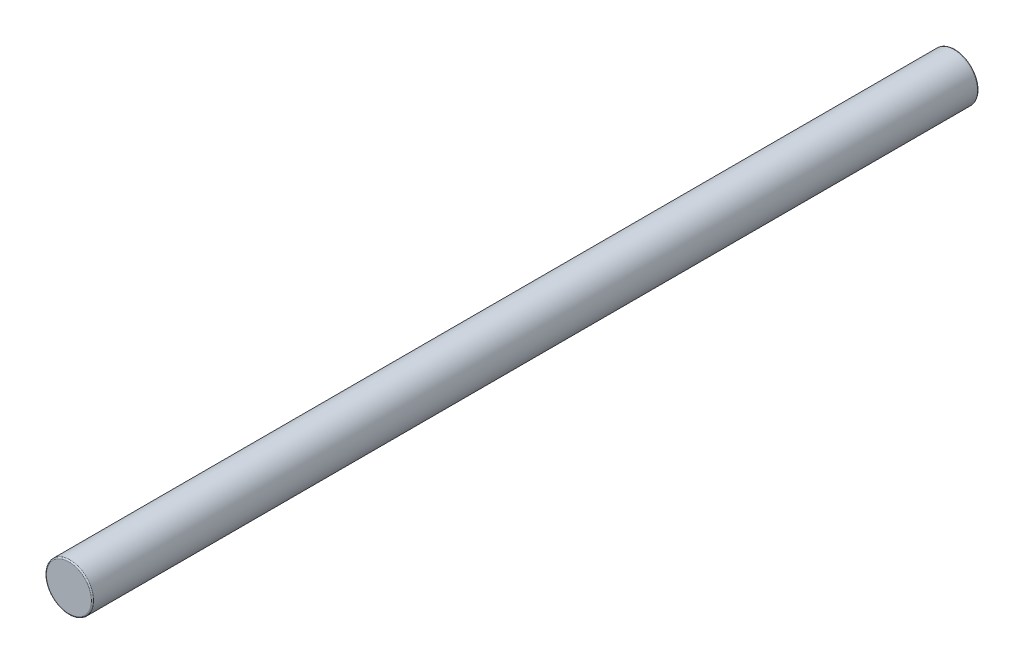
ISO-10303-21;
HEADER;
FILE_DESCRIPTION(('STEP AP214'),'2;1');
FILE_NAME('part.step','',(''),(''),'','','');
FILE_SCHEMA(('AUTOMOTIVE_DESIGN { 1 0 10303 214 1 1 1 1 }'));
ENDSEC;
DATA;
#1=APPLICATION_CONTEXT('core data for automotive mechanical design processes');
#2=APPLICATION_PROTOCOL_DEFINITION('international standard','automotive_design',2000,#1);
#3=PRODUCT_CONTEXT('',#1,'mechanical');
#4=PRODUCT('Part','Part','',(#3));
#5=PRODUCT_RELATED_PRODUCT_CATEGORY('part','',(#4));
#6=PRODUCT_DEFINITION_FORMATION('','',#4);
#7=PRODUCT_DEFINITION_CONTEXT('part definition',#1,'design');
#8=PRODUCT_DEFINITION('design','',#6,#7);
#9=PRODUCT_DEFINITION_SHAPE('','',#8);
#10=(LENGTH_UNIT() NAMED_UNIT(*) SI_UNIT(.MILLI.,.METRE.));
#11=(NAMED_UNIT(*) PLANE_ANGLE_UNIT() SI_UNIT($,.RADIAN.));
#12=(NAMED_UNIT(*) SI_UNIT($,.STERADIAN.) SOLID_ANGLE_UNIT());
#13=UNCERTAINTY_MEASURE_WITH_UNIT(LENGTH_MEASURE(1.E-05),#10,'distance_accuracy_value','');
#14=(GEOMETRIC_REPRESENTATION_CONTEXT(3) GLOBAL_UNCERTAINTY_ASSIGNED_CONTEXT((#13)) GLOBAL_UNIT_ASSIGNED_CONTEXT((#10,
#11,#12)) REPRESENTATION_CONTEXT('',''));
#15=CARTESIAN_POINT('',(0.,0.,0.));
#16=DIRECTION('',(0.,0.,1.));
#17=DIRECTION('',(1.,0.,0.));
#18=AXIS2_PLACEMENT_3D('',#15,#16,#17);
#19=CARTESIAN_POINT('',(0.,0.,-150.));
#20=DIRECTION('',(0.,0.,1.));
#21=DIRECTION('',(1.,0.,0.));
#22=AXIS2_PLACEMENT_3D('',#19,#20,#21);
#23=CYLINDRICAL_SURFACE('',#22,4.);
#24=CARTESIAN_POINT('',(0.,0.,-149.8));
#25=DIRECTION('',(0.,0.,1.));
#26=DIRECTION('',(1.,0.,0.));
#27=AXIS2_PLACEMENT_3D('',#24,#25,#26);
#28=CIRCLE('',#27,4.);
#29=CARTESIAN_POINT('',(4.,0.,-149.8));
#30=VERTEX_POINT('',#29);
#31=EDGE_CURVE('E46',#30,#30,#28,.T.);
#32=ORIENTED_EDGE('',*,*,#31,.T.);
#33=EDGE_LOOP('',(#32));
#34=FACE_BOUND('',#33,.T.);
#35=CARTESIAN_POINT('',(0.,0.,-0.200000000000006));
#36=DIRECTION('',(0.,0.,1.));
#37=DIRECTION('',(1.,0.,0.));
#38=AXIS2_PLACEMENT_3D('',#35,#36,#37);
#39=CIRCLE('',#38,4.);
#40=CARTESIAN_POINT('',(4.,0.,-0.200000000000006));
#41=VERTEX_POINT('',#40);
#42=EDGE_CURVE('E50',#41,#41,#39,.F.);
#43=ORIENTED_EDGE('',*,*,#42,.T.);
#44=EDGE_LOOP('',(#43));
#45=FACE_BOUND('',#44,.T.);
#46=ADVANCED_FACE('F35',(#34,#45),#23,.T.);
#47=CARTESIAN_POINT('',(0.,0.,-150.));
#48=DIRECTION('',(0.,0.,1.));
#49=DIRECTION('',(1.,0.,0.));
#50=AXIS2_PLACEMENT_3D('',#47,#48,#49);
#51=PLANE('',#50);
#52=CARTESIAN_POINT('',(0.,0.,-150.));
#53=DIRECTION('',(0.,0.,1.));
#54=DIRECTION('',(1.,0.,0.));
#55=AXIS2_PLACEMENT_3D('',#52,#53,#54);
#56=CIRCLE('',#55,3.8);
#57=CARTESIAN_POINT('',(3.8,0.,-150.));
#58=VERTEX_POINT('',#57);
#59=EDGE_CURVE('E42',#58,#58,#56,.F.);
#60=ORIENTED_EDGE('',*,*,#59,.T.);
#61=EDGE_LOOP('',(#60));
#62=FACE_BOUND('',#61,.T.);
#63=ADVANCED_FACE('F66',(#62),#51,.F.);
#64=CARTESIAN_POINT('',(0.,0.,0.));
#65=DIRECTION('',(0.,0.,1.));
#66=DIRECTION('',(1.,0.,0.));
#67=AXIS2_PLACEMENT_3D('',#64,#65,#66);
#68=PLANE('',#67);
#69=CARTESIAN_POINT('',(0.,0.,0.));
#70=DIRECTION('',(0.,0.,1.));
#71=DIRECTION('',(1.,0.,0.));
#72=AXIS2_PLACEMENT_3D('',#69,#70,#71);
#73=CIRCLE('',#72,3.8);
#74=CARTESIAN_POINT('',(3.8,0.,0.));
#75=VERTEX_POINT('',#74);
#76=EDGE_CURVE('E10',#75,#75,#73,.T.);
#77=ORIENTED_EDGE('',*,*,#76,.T.);
#78=EDGE_LOOP('',(#77));
#79=FACE_BOUND('',#78,.T.);
#80=ADVANCED_FACE('F63',(#79),#68,.T.);
#81=CARTESIAN_POINT('',(0.,0.,-149.8));
#82=DIRECTION('',(0.,0.,1.));
#83=DIRECTION('',(1.,0.,0.));
#84=AXIS2_PLACEMENT_3D('',#81,#82,#83);
#85=TOROIDAL_SURFACE('',#84,3.8,0.2);
#86=ORIENTED_EDGE('',*,*,#59,.F.);
#87=EDGE_LOOP('',(#86));
#88=FACE_BOUND('',#87,.T.);
#89=ORIENTED_EDGE('',*,*,#31,.F.);
#90=EDGE_LOOP('',(#89));
#91=FACE_BOUND('',#90,.T.);
#92=ADVANCED_FACE('F59',(#88,#91),#85,.T.);
#93=CARTESIAN_POINT('',(0.,0.,-0.200000000000006));
#94=DIRECTION('',(0.,0.,1.));
#95=DIRECTION('',(1.,0.,0.));
#96=AXIS2_PLACEMENT_3D('',#93,#94,#95);
#97=TOROIDAL_SURFACE('',#96,3.8,0.2);
#98=ORIENTED_EDGE('',*,*,#42,.F.);
#99=EDGE_LOOP('',(#98));
#100=FACE_BOUND('',#99,.T.);
#101=ORIENTED_EDGE('',*,*,#76,.F.);
#102=EDGE_LOOP('',(#101));
#103=FACE_BOUND('',#102,.T.);
#104=ADVANCED_FACE('F37',(#100,#103),#97,.T.);
#105=CLOSED_SHELL('',(#46,#63,#80,#92,#104));
#106=MANIFOLD_SOLID_BREP('B2',#105);
#107=ADVANCED_BREP_SHAPE_REPRESENTATION('',(#18,#106),#14);
#108=SHAPE_DEFINITION_REPRESENTATION(#9,#107);
ENDSEC;
END-ISO-10303-21;
